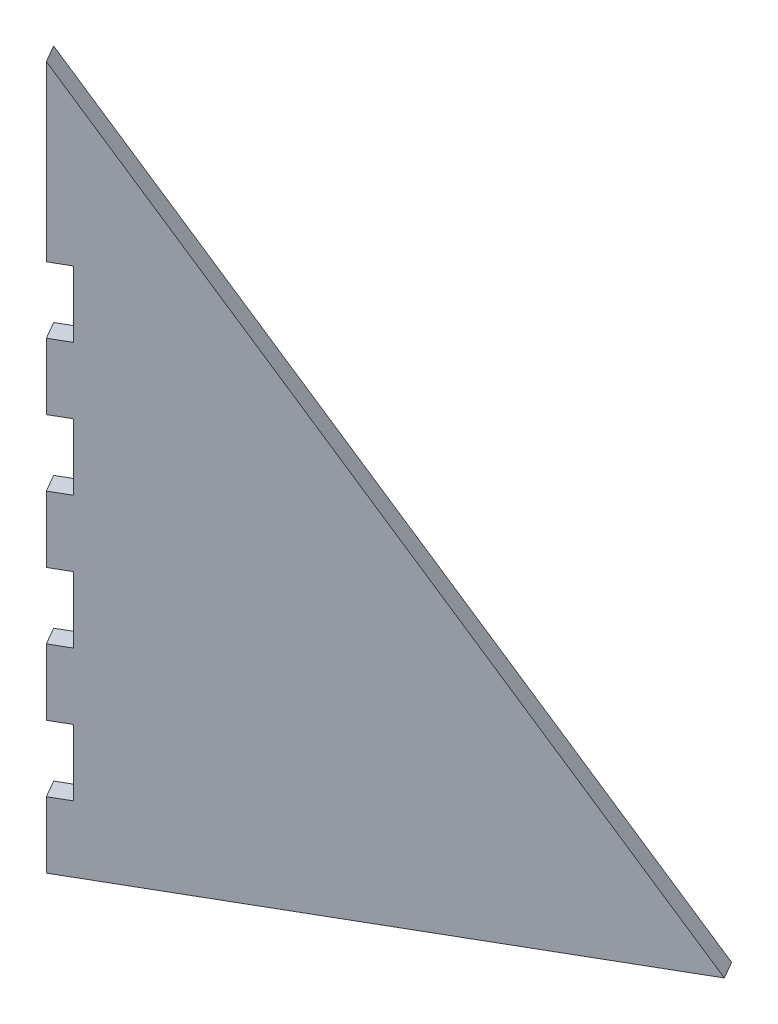
ISO-10303-21;
HEADER;
FILE_DESCRIPTION(('STEP AP214'),'2;1');
FILE_NAME('part.step','',(''),(''),'','','');
FILE_SCHEMA(('AUTOMOTIVE_DESIGN { 1 0 10303 214 1 1 1 1 }'));
ENDSEC;
DATA;
#1=APPLICATION_CONTEXT('core data for automotive mechanical design processes');
#2=APPLICATION_PROTOCOL_DEFINITION('international standard','automotive_design',2000,#1);
#3=PRODUCT_CONTEXT('',#1,'mechanical');
#4=PRODUCT('Part','Part','',(#3));
#5=PRODUCT_RELATED_PRODUCT_CATEGORY('part','',(#4));
#6=PRODUCT_DEFINITION_FORMATION('','',#4);
#7=PRODUCT_DEFINITION_CONTEXT('part definition',#1,'design');
#8=PRODUCT_DEFINITION('design','',#6,#7);
#9=PRODUCT_DEFINITION_SHAPE('','',#8);
#10=(LENGTH_UNIT() NAMED_UNIT(*) SI_UNIT(.MILLI.,.METRE.));
#11=(NAMED_UNIT(*) PLANE_ANGLE_UNIT() SI_UNIT($,.RADIAN.));
#12=(NAMED_UNIT(*) SI_UNIT($,.STERADIAN.) SOLID_ANGLE_UNIT());
#13=UNCERTAINTY_MEASURE_WITH_UNIT(LENGTH_MEASURE(1.E-05),#10,'distance_accuracy_value','');
#14=(GEOMETRIC_REPRESENTATION_CONTEXT(3) GLOBAL_UNCERTAINTY_ASSIGNED_CONTEXT((#13)) GLOBAL_UNIT_ASSIGNED_CONTEXT((#10,
#11,#12)) REPRESENTATION_CONTEXT('',''));
#15=CARTESIAN_POINT('',(0.,0.,0.));
#16=DIRECTION('',(0.,0.,1.));
#17=DIRECTION('',(1.,0.,0.));
#18=AXIS2_PLACEMENT_3D('',#15,#16,#17);
#19=CARTESIAN_POINT('',(207.708225560257,79.9999999999998,353.761199820341));
#20=DIRECTION('',(0.866025403784437,0.,-0.500000000000002));
#21=DIRECTION('',(-0.500000000000002,0.,-0.866025403784437));
#22=AXIS2_PLACEMENT_3D('',#19,#20,#21);
#23=PLANE('',#22);
#24=DIRECTION('',(0.,1.,0.));
#25=VECTOR('',#24,1.);
#26=CARTESIAN_POINT('',(209.208225560257,79.9999999999998,356.359276031694));
#27=LINE('',#26,#25);
#28=CARTESIAN_POINT('',(209.208225560257,79.9999999999998,356.359276031694));
#29=VERTEX_POINT('',#28);
#30=CARTESIAN_POINT('',(209.208225560257,106.192051124606,356.359276031694));
#31=VERTEX_POINT('',#30);
#32=EDGE_CURVE('E195',#29,#31,#27,.T.);
#33=ORIENTED_EDGE('',*,*,#32,.T.);
#34=DIRECTION('',(0.500000000000002,0.,0.866025403784437));
#35=VECTOR('',#34,1.);
#36=CARTESIAN_POINT('',(207.708225560257,106.192051124606,353.761199820341));
#37=LINE('',#36,#35);
#38=CARTESIAN_POINT('',(207.708225560257,106.192051124606,353.761199820341));
#39=VERTEX_POINT('',#38);
#40=EDGE_CURVE('E11',#39,#31,#37,.T.);
#41=ORIENTED_EDGE('',*,*,#40,.F.);
#42=DIRECTION('',(0.,1.,0.));
#43=VECTOR('',#42,1.);
#44=CARTESIAN_POINT('',(207.708225560257,79.9999999999998,353.761199820341));
#45=LINE('',#44,#43);
#46=CARTESIAN_POINT('',(207.708225560257,79.9999999999998,353.761199820341));
#47=VERTEX_POINT('',#46);
#48=EDGE_CURVE('E231',#47,#39,#45,.T.);
#49=ORIENTED_EDGE('',*,*,#48,.F.);
#50=DIRECTION('',(0.500000000000002,0.,0.866025403784437));
#51=VECTOR('',#50,1.);
#52=CARTESIAN_POINT('',(207.708225560257,79.9999999999998,353.761199820341));
#53=LINE('',#52,#51);
#54=EDGE_CURVE('E191',#47,#29,#53,.T.);
#55=ORIENTED_EDGE('',*,*,#54,.T.);
#56=EDGE_LOOP('',(#33,#41,#49,#55));
#57=FACE_BOUND('',#56,.T.);
#58=ADVANCED_FACE('F33',(#57),#23,.F.);
#59=CARTESIAN_POINT('',(207.708225560257,106.192051124606,353.761199820341));
#60=DIRECTION('',(-0.707386524128565,-0.576893179576377,0.408409800126743));
#61=DIRECTION('',(0.632004833598678,-0.774964444544333,0.));
#62=AXIS2_PLACEMENT_3D('',#59,#60,#61);
#63=PLANE('',#62);
#64=DIRECTION('',(0.49960414878312,-0.816819600253482,-0.28844658978819));
#65=VECTOR('',#64,1.);
#66=CARTESIAN_POINT('',(209.208225560257,106.192051124606,356.359276031694));
#67=LINE('',#66,#65);
#68=CARTESIAN_POINT('',(274.16013084409,-2.89305556641071E-13,318.859276031694));
#69=VERTEX_POINT('',#68);
#70=EDGE_CURVE('E198',#31,#69,#67,.T.);
#71=ORIENTED_EDGE('',*,*,#70,.T.);
#72=DIRECTION('',(0.500000000000002,0.,0.866025403784437));
#73=VECTOR('',#72,1.);
#74=CARTESIAN_POINT('',(272.66013084409,-2.89305556641071E-13,316.261199820341));
#75=LINE('',#74,#73);
#76=CARTESIAN_POINT('',(272.66013084409,-2.89305556641071E-13,316.261199820341));
#77=VERTEX_POINT('',#76);
#78=EDGE_CURVE('E41',#77,#69,#75,.T.);
#79=ORIENTED_EDGE('',*,*,#78,.F.);
#80=DIRECTION('',(0.49960414878312,-0.816819600253482,-0.28844658978819));
#81=VECTOR('',#80,1.);
#82=CARTESIAN_POINT('',(207.708225560257,106.192051124606,353.761199820341));
#83=LINE('',#82,#81);
#84=EDGE_CURVE('E125',#39,#77,#83,.T.);
#85=ORIENTED_EDGE('',*,*,#84,.F.);
#86=ORIENTED_EDGE('',*,*,#40,.T.);
#87=EDGE_LOOP('',(#71,#79,#85,#86));
#88=FACE_BOUND('',#87,.T.);
#89=ADVANCED_FACE('F344',(#88),#63,.F.);
#90=CARTESIAN_POINT('',(272.66013084409,-2.89305556641071E-13,316.261199820341));
#91=DIRECTION('',(0.,1.,0.));
#92=DIRECTION('',(-1.,0.,0.));
#93=AXIS2_PLACEMENT_3D('',#90,#91,#92);
#94=PLANE('',#93);
#95=DIRECTION('',(-0.866025403784437,0.,0.500000000000003));
#96=VECTOR('',#95,1.);
#97=CARTESIAN_POINT('',(274.16013084409,-2.89305556641071E-13,318.859276031694));
#98=LINE('',#97,#96);
#99=CARTESIAN_POINT('',(209.208225560257,0.,356.359276031695));
#100=VERTEX_POINT('',#99);
#101=EDGE_CURVE('E200',#69,#100,#98,.T.);
#102=ORIENTED_EDGE('',*,*,#101,.T.);
#103=DIRECTION('',(0.500000000000002,0.,0.866025403784437));
#104=VECTOR('',#103,1.);
#105=CARTESIAN_POINT('',(207.708225560257,0.,353.761199820341));
#106=LINE('',#105,#104);
#107=CARTESIAN_POINT('',(207.708225560257,0.,353.761199820341));
#108=VERTEX_POINT('',#107);
#109=EDGE_CURVE('E271',#108,#100,#106,.T.);
#110=ORIENTED_EDGE('',*,*,#109,.F.);
#111=DIRECTION('',(-0.866025403784437,0.,0.500000000000003));
#112=VECTOR('',#111,1.);
#113=CARTESIAN_POINT('',(272.66013084409,-2.89305556641071E-13,316.261199820341));
#114=LINE('',#113,#112);
#115=EDGE_CURVE('E279',#77,#108,#114,.T.);
#116=ORIENTED_EDGE('',*,*,#115,.F.);
#117=ORIENTED_EDGE('',*,*,#78,.T.);
#118=EDGE_LOOP('',(#102,#110,#116,#117));
#119=FACE_BOUND('',#118,.T.);
#120=ADVANCED_FACE('F277',(#119),#94,.F.);
#121=CARTESIAN_POINT('',(207.708225560257,0.,353.761199820341));
#122=DIRECTION('',(0.866025403784437,0.,-0.500000000000002));
#123=DIRECTION('',(-0.500000000000002,0.,-0.866025403784437));
#124=AXIS2_PLACEMENT_3D('',#121,#122,#123);
#125=PLANE('',#124);
#126=DIRECTION('',(0.,1.,0.));
#127=VECTOR('',#126,1.);
#128=CARTESIAN_POINT('',(209.208225560257,0.,356.359276031695));
#129=LINE('',#128,#127);
#130=CARTESIAN_POINT('',(209.208225560257,9.99999999999973,356.359276031695));
#131=VERTEX_POINT('',#130);
#132=EDGE_CURVE('E202',#100,#131,#129,.T.);
#133=ORIENTED_EDGE('',*,*,#132,.T.);
#134=DIRECTION('',(0.500000000000002,0.,0.866025403784437));
#135=VECTOR('',#134,1.);
#136=CARTESIAN_POINT('',(207.708225560257,9.99999999999973,353.761199820341));
#137=LINE('',#136,#135);
#138=CARTESIAN_POINT('',(207.708225560257,9.99999999999973,353.761199820341));
#139=VERTEX_POINT('',#138);
#140=EDGE_CURVE('E268',#139,#131,#137,.T.);
#141=ORIENTED_EDGE('',*,*,#140,.F.);
#142=DIRECTION('',(0.,1.,0.));
#143=VECTOR('',#142,1.);
#144=CARTESIAN_POINT('',(207.708225560257,0.,353.761199820341));
#145=LINE('',#144,#143);
#146=EDGE_CURVE('E297',#108,#139,#145,.T.);
#147=ORIENTED_EDGE('',*,*,#146,.F.);
#148=ORIENTED_EDGE('',*,*,#109,.T.);
#149=EDGE_LOOP('',(#133,#141,#147,#148));
#150=FACE_BOUND('',#149,.T.);
#151=ADVANCED_FACE('F288',(#150),#125,.F.);
#152=CARTESIAN_POINT('',(210.30630177161,9.99999999999971,352.261199820341));
#153=DIRECTION('',(0.,-1.,0.));
#154=DIRECTION('',(1.,0.,0.));
#155=AXIS2_PLACEMENT_3D('',#152,#153,#154);
#156=PLANE('',#155);
#157=DIRECTION('',(0.866025403784434,0.,-0.500000000000008));
#158=VECTOR('',#157,1.);
#159=CARTESIAN_POINT('',(211.80630177161,9.99999999999971,354.859276031694));
#160=LINE('',#159,#158);
#161=CARTESIAN_POINT('',(211.80630177161,9.99999999999971,354.859276031694));
#162=VERTEX_POINT('',#161);
#163=EDGE_CURVE('E204',#131,#162,#160,.T.);
#164=ORIENTED_EDGE('',*,*,#163,.T.);
#165=DIRECTION('',(0.500000000000002,0.,0.866025403784437));
#166=VECTOR('',#165,1.);
#167=CARTESIAN_POINT('',(210.30630177161,9.99999999999971,352.261199820341));
#168=LINE('',#167,#166);
#169=CARTESIAN_POINT('',(210.30630177161,9.99999999999971,352.261199820341));
#170=VERTEX_POINT('',#169);
#171=EDGE_CURVE('E265',#170,#162,#168,.T.);
#172=ORIENTED_EDGE('',*,*,#171,.F.);
#173=DIRECTION('',(0.866025403784434,0.,-0.500000000000008));
#174=VECTOR('',#173,1.);
#175=CARTESIAN_POINT('',(210.30630177161,9.99999999999971,352.261199820341));
#176=LINE('',#175,#174);
#177=EDGE_CURVE('E294',#139,#170,#176,.T.);
#178=ORIENTED_EDGE('',*,*,#177,.F.);
#179=ORIENTED_EDGE('',*,*,#140,.T.);
#180=EDGE_LOOP('',(#164,#172,#178,#179));
#181=FACE_BOUND('',#180,.T.);
#182=ADVANCED_FACE('F292',(#181),#156,.F.);
#183=CARTESIAN_POINT('',(210.30630177161,9.99999999999971,352.261199820341));
#184=DIRECTION('',(0.866025403784437,0.,-0.500000000000002));
#185=DIRECTION('',(-0.500000000000002,0.,-0.866025403784437));
#186=AXIS2_PLACEMENT_3D('',#183,#184,#185);
#187=PLANE('',#186);
#188=DIRECTION('',(0.,1.,0.));
#189=VECTOR('',#188,1.);
#190=CARTESIAN_POINT('',(211.80630177161,9.99999999999971,354.859276031694));
#191=LINE('',#190,#189);
#192=CARTESIAN_POINT('',(211.806301771611,19.9999999999997,354.859276031694));
#193=VERTEX_POINT('',#192);
#194=EDGE_CURVE('E206',#162,#193,#191,.T.);
#195=ORIENTED_EDGE('',*,*,#194,.T.);
#196=DIRECTION('',(0.500000000000002,0.,0.866025403784437));
#197=VECTOR('',#196,1.);
#198=CARTESIAN_POINT('',(210.306301771611,19.9999999999997,352.261199820341));
#199=LINE('',#198,#197);
#200=CARTESIAN_POINT('',(210.306301771611,19.9999999999997,352.261199820341));
#201=VERTEX_POINT('',#200);
#202=EDGE_CURVE('E262',#201,#193,#199,.T.);
#203=ORIENTED_EDGE('',*,*,#202,.F.);
#204=DIRECTION('',(0.,1.,0.));
#205=VECTOR('',#204,1.);
#206=CARTESIAN_POINT('',(210.30630177161,9.99999999999971,352.261199820341));
#207=LINE('',#206,#205);
#208=EDGE_CURVE('E296',#170,#201,#207,.T.);
#209=ORIENTED_EDGE('',*,*,#208,.F.);
#210=ORIENTED_EDGE('',*,*,#171,.T.);
#211=EDGE_LOOP('',(#195,#203,#209,#210));
#212=FACE_BOUND('',#211,.T.);
#213=ADVANCED_FACE('F357',(#212),#187,.F.);
#214=CARTESIAN_POINT('',(210.306301771611,19.9999999999997,352.261199820341));
#215=DIRECTION('',(0.,1.,0.));
#216=DIRECTION('',(-1.,0.,0.));
#217=AXIS2_PLACEMENT_3D('',#214,#215,#216);
#218=PLANE('',#217);
#219=DIRECTION('',(-0.866025403784433,0.,0.50000000000001));
#220=VECTOR('',#219,1.);
#221=CARTESIAN_POINT('',(211.806301771611,19.9999999999997,354.859276031694));
#222=LINE('',#221,#220);
#223=CARTESIAN_POINT('',(209.208225560257,19.9999999999997,356.359276031695));
#224=VERTEX_POINT('',#223);
#225=EDGE_CURVE('E208',#193,#224,#222,.T.);
#226=ORIENTED_EDGE('',*,*,#225,.T.);
#227=DIRECTION('',(0.500000000000002,0.,0.866025403784437));
#228=VECTOR('',#227,1.);
#229=CARTESIAN_POINT('',(207.708225560257,19.9999999999997,353.761199820341));
#230=LINE('',#229,#228);
#231=CARTESIAN_POINT('',(207.708225560257,19.9999999999997,353.761199820341));
#232=VERTEX_POINT('',#231);
#233=EDGE_CURVE('E259',#232,#224,#230,.T.);
#234=ORIENTED_EDGE('',*,*,#233,.F.);
#235=DIRECTION('',(-0.866025403784433,0.,0.50000000000001));
#236=VECTOR('',#235,1.);
#237=CARTESIAN_POINT('',(210.306301771611,19.9999999999997,352.261199820341));
#238=LINE('',#237,#236);
#239=EDGE_CURVE('E299',#201,#232,#238,.T.);
#240=ORIENTED_EDGE('',*,*,#239,.F.);
#241=ORIENTED_EDGE('',*,*,#202,.T.);
#242=EDGE_LOOP('',(#226,#234,#240,#241));
#243=FACE_BOUND('',#242,.T.);
#244=ADVANCED_FACE('F360',(#243),#218,.F.);
#245=CARTESIAN_POINT('',(207.708225560257,19.9999999999997,353.761199820341));
#246=DIRECTION('',(0.866025403784437,0.,-0.500000000000002));
#247=DIRECTION('',(-0.500000000000002,0.,-0.866025403784437));
#248=AXIS2_PLACEMENT_3D('',#245,#246,#247);
#249=PLANE('',#248);
#250=DIRECTION('',(0.,1.,0.));
#251=VECTOR('',#250,1.);
#252=CARTESIAN_POINT('',(209.208225560257,19.9999999999997,356.359276031695));
#253=LINE('',#252,#251);
#254=CARTESIAN_POINT('',(209.208225560257,29.9999999999998,356.359276031695));
#255=VERTEX_POINT('',#254);
#256=EDGE_CURVE('E210',#224,#255,#253,.T.);
#257=ORIENTED_EDGE('',*,*,#256,.T.);
#258=DIRECTION('',(0.500000000000002,0.,0.866025403784437));
#259=VECTOR('',#258,1.);
#260=CARTESIAN_POINT('',(207.708225560257,29.9999999999998,353.761199820341));
#261=LINE('',#260,#259);
#262=CARTESIAN_POINT('',(207.708225560257,29.9999999999998,353.761199820341));
#263=VERTEX_POINT('',#262);
#264=EDGE_CURVE('E256',#263,#255,#261,.T.);
#265=ORIENTED_EDGE('',*,*,#264,.F.);
#266=DIRECTION('',(0.,1.,0.));
#267=VECTOR('',#266,1.);
#268=CARTESIAN_POINT('',(207.708225560257,19.9999999999997,353.761199820341));
#269=LINE('',#268,#267);
#270=EDGE_CURVE('E305',#232,#263,#269,.T.);
#271=ORIENTED_EDGE('',*,*,#270,.F.);
#272=ORIENTED_EDGE('',*,*,#233,.T.);
#273=EDGE_LOOP('',(#257,#265,#271,#272));
#274=FACE_BOUND('',#273,.T.);
#275=ADVANCED_FACE('F364',(#274),#249,.F.);
#276=CARTESIAN_POINT('',(210.30630177161,29.9999999999999,352.261199820341));
#277=DIRECTION('',(0.,-1.,0.));
#278=DIRECTION('',(1.,0.,0.));
#279=AXIS2_PLACEMENT_3D('',#276,#277,#278);
#280=PLANE('',#279);
#281=DIRECTION('',(0.866025403784429,0.,-0.500000000000016));
#282=VECTOR('',#281,1.);
#283=CARTESIAN_POINT('',(211.80630177161,29.9999999999999,354.859276031694));
#284=LINE('',#283,#282);
#285=CARTESIAN_POINT('',(211.80630177161,29.9999999999999,354.859276031694));
#286=VERTEX_POINT('',#285);
#287=EDGE_CURVE('E212',#255,#286,#284,.T.);
#288=ORIENTED_EDGE('',*,*,#287,.T.);
#289=DIRECTION('',(0.500000000000002,0.,0.866025403784437));
#290=VECTOR('',#289,1.);
#291=CARTESIAN_POINT('',(210.30630177161,29.9999999999999,352.261199820341));
#292=LINE('',#291,#290);
#293=CARTESIAN_POINT('',(210.30630177161,29.9999999999999,352.261199820341));
#294=VERTEX_POINT('',#293);
#295=EDGE_CURVE('E253',#294,#286,#292,.T.);
#296=ORIENTED_EDGE('',*,*,#295,.F.);
#297=DIRECTION('',(0.866025403784429,0.,-0.500000000000016));
#298=VECTOR('',#297,1.);
#299=CARTESIAN_POINT('',(210.30630177161,29.9999999999999,352.261199820341));
#300=LINE('',#299,#298);
#301=EDGE_CURVE('E307',#263,#294,#300,.T.);
#302=ORIENTED_EDGE('',*,*,#301,.F.);
#303=ORIENTED_EDGE('',*,*,#264,.T.);
#304=EDGE_LOOP('',(#288,#296,#302,#303));
#305=FACE_BOUND('',#304,.T.);
#306=ADVANCED_FACE('F368',(#305),#280,.F.);
#307=CARTESIAN_POINT('',(210.30630177161,29.9999999999999,352.261199820341));
#308=DIRECTION('',(0.866025403784437,0.,-0.500000000000002));
#309=DIRECTION('',(-0.500000000000002,0.,-0.866025403784437));
#310=AXIS2_PLACEMENT_3D('',#307,#308,#309);
#311=PLANE('',#310);
#312=DIRECTION('',(0.,1.,0.));
#313=VECTOR('',#312,1.);
#314=CARTESIAN_POINT('',(211.80630177161,29.9999999999999,354.859276031694));
#315=LINE('',#314,#313);
#316=CARTESIAN_POINT('',(211.80630177161,39.9999999999999,354.859276031694));
#317=VERTEX_POINT('',#316);
#318=EDGE_CURVE('E214',#286,#317,#315,.T.);
#319=ORIENTED_EDGE('',*,*,#318,.T.);
#320=DIRECTION('',(0.500000000000002,0.,0.866025403784437));
#321=VECTOR('',#320,1.);
#322=CARTESIAN_POINT('',(210.30630177161,39.9999999999999,352.261199820341));
#323=LINE('',#322,#321);
#324=CARTESIAN_POINT('',(210.30630177161,39.9999999999999,352.261199820341));
#325=VERTEX_POINT('',#324);
#326=EDGE_CURVE('E250',#325,#317,#323,.T.);
#327=ORIENTED_EDGE('',*,*,#326,.F.);
#328=DIRECTION('',(0.,1.,0.));
#329=VECTOR('',#328,1.);
#330=CARTESIAN_POINT('',(210.30630177161,29.9999999999999,352.261199820341));
#331=LINE('',#330,#329);
#332=EDGE_CURVE('E309',#294,#325,#331,.T.);
#333=ORIENTED_EDGE('',*,*,#332,.F.);
#334=ORIENTED_EDGE('',*,*,#295,.T.);
#335=EDGE_LOOP('',(#319,#327,#333,#334));
#336=FACE_BOUND('',#335,.T.);
#337=ADVANCED_FACE('F372',(#336),#311,.F.);
#338=CARTESIAN_POINT('',(210.30630177161,39.9999999999999,352.261199820341));
#339=DIRECTION('',(0.,1.,0.));
#340=DIRECTION('',(-1.,0.,0.));
#341=AXIS2_PLACEMENT_3D('',#338,#339,#340);
#342=PLANE('',#341);
#343=DIRECTION('',(-0.866025403784429,0.,0.500000000000016));
#344=VECTOR('',#343,1.);
#345=CARTESIAN_POINT('',(211.80630177161,39.9999999999999,354.859276031694));
#346=LINE('',#345,#344);
#347=CARTESIAN_POINT('',(209.208225560257,39.9999999999998,356.359276031695));
#348=VERTEX_POINT('',#347);
#349=EDGE_CURVE('E216',#317,#348,#346,.T.);
#350=ORIENTED_EDGE('',*,*,#349,.T.);
#351=DIRECTION('',(0.500000000000002,0.,0.866025403784437));
#352=VECTOR('',#351,1.);
#353=CARTESIAN_POINT('',(207.708225560257,39.9999999999998,353.761199820341));
#354=LINE('',#353,#352);
#355=CARTESIAN_POINT('',(207.708225560257,39.9999999999998,353.761199820341));
#356=VERTEX_POINT('',#355);
#357=EDGE_CURVE('E247',#356,#348,#354,.T.);
#358=ORIENTED_EDGE('',*,*,#357,.F.);
#359=DIRECTION('',(-0.866025403784429,0.,0.500000000000016));
#360=VECTOR('',#359,1.);
#361=CARTESIAN_POINT('',(210.30630177161,39.9999999999999,352.261199820341));
#362=LINE('',#361,#360);
#363=EDGE_CURVE('E311',#325,#356,#362,.T.);
#364=ORIENTED_EDGE('',*,*,#363,.F.);
#365=ORIENTED_EDGE('',*,*,#326,.T.);
#366=EDGE_LOOP('',(#350,#358,#364,#365));
#367=FACE_BOUND('',#366,.T.);
#368=ADVANCED_FACE('F376',(#367),#342,.F.);
#369=CARTESIAN_POINT('',(207.708225560257,39.9999999999998,353.761199820341));
#370=DIRECTION('',(0.866025403784437,0.,-0.500000000000002));
#371=DIRECTION('',(-0.500000000000002,0.,-0.866025403784437));
#372=AXIS2_PLACEMENT_3D('',#369,#370,#371);
#373=PLANE('',#372);
#374=DIRECTION('',(0.,1.,0.));
#375=VECTOR('',#374,1.);
#376=CARTESIAN_POINT('',(209.208225560257,39.9999999999998,356.359276031695));
#377=LINE('',#376,#375);
#378=CARTESIAN_POINT('',(209.208225560257,49.9999999999998,356.359276031695));
#379=VERTEX_POINT('',#378);
#380=EDGE_CURVE('E218',#348,#379,#377,.T.);
#381=ORIENTED_EDGE('',*,*,#380,.T.);
#382=DIRECTION('',(0.500000000000002,0.,0.866025403784437));
#383=VECTOR('',#382,1.);
#384=CARTESIAN_POINT('',(207.708225560257,49.9999999999998,353.761199820341));
#385=LINE('',#384,#383);
#386=CARTESIAN_POINT('',(207.708225560257,49.9999999999998,353.761199820341));
#387=VERTEX_POINT('',#386);
#388=EDGE_CURVE('E244',#387,#379,#385,.T.);
#389=ORIENTED_EDGE('',*,*,#388,.F.);
#390=DIRECTION('',(0.,1.,0.));
#391=VECTOR('',#390,1.);
#392=CARTESIAN_POINT('',(207.708225560257,39.9999999999998,353.761199820341));
#393=LINE('',#392,#391);
#394=EDGE_CURVE('E313',#356,#387,#393,.T.);
#395=ORIENTED_EDGE('',*,*,#394,.F.);
#396=ORIENTED_EDGE('',*,*,#357,.T.);
#397=EDGE_LOOP('',(#381,#389,#395,#396));
#398=FACE_BOUND('',#397,.T.);
#399=ADVANCED_FACE('F380',(#398),#373,.F.);
#400=CARTESIAN_POINT('',(210.30630177161,49.9999999999999,352.261199820341));
#401=DIRECTION('',(0.,-1.,0.));
#402=DIRECTION('',(1.,0.,0.));
#403=AXIS2_PLACEMENT_3D('',#400,#401,#402);
#404=PLANE('',#403);
#405=DIRECTION('',(0.866025403784429,0.,-0.500000000000016));
#406=VECTOR('',#405,1.);
#407=CARTESIAN_POINT('',(211.80630177161,49.9999999999999,354.859276031694));
#408=LINE('',#407,#406);
#409=CARTESIAN_POINT('',(211.80630177161,49.9999999999999,354.859276031694));
#410=VERTEX_POINT('',#409);
#411=EDGE_CURVE('E220',#379,#410,#408,.T.);
#412=ORIENTED_EDGE('',*,*,#411,.T.);
#413=DIRECTION('',(0.500000000000002,0.,0.866025403784437));
#414=VECTOR('',#413,1.);
#415=CARTESIAN_POINT('',(210.30630177161,49.9999999999999,352.261199820341));
#416=LINE('',#415,#414);
#417=CARTESIAN_POINT('',(210.30630177161,49.9999999999999,352.261199820341));
#418=VERTEX_POINT('',#417);
#419=EDGE_CURVE('E241',#418,#410,#416,.T.);
#420=ORIENTED_EDGE('',*,*,#419,.F.);
#421=DIRECTION('',(0.866025403784429,0.,-0.500000000000016));
#422=VECTOR('',#421,1.);
#423=CARTESIAN_POINT('',(210.30630177161,49.9999999999999,352.261199820341));
#424=LINE('',#423,#422);
#425=EDGE_CURVE('E315',#387,#418,#424,.T.);
#426=ORIENTED_EDGE('',*,*,#425,.F.);
#427=ORIENTED_EDGE('',*,*,#388,.T.);
#428=EDGE_LOOP('',(#412,#420,#426,#427));
#429=FACE_BOUND('',#428,.T.);
#430=ADVANCED_FACE('F384',(#429),#404,.F.);
#431=CARTESIAN_POINT('',(210.30630177161,49.9999999999999,352.261199820341));
#432=DIRECTION('',(0.866025403784437,0.,-0.500000000000002));
#433=DIRECTION('',(-0.500000000000002,0.,-0.866025403784437));
#434=AXIS2_PLACEMENT_3D('',#431,#432,#433);
#435=PLANE('',#434);
#436=DIRECTION('',(0.,1.,0.));
#437=VECTOR('',#436,1.);
#438=CARTESIAN_POINT('',(211.80630177161,49.9999999999999,354.859276031694));
#439=LINE('',#438,#437);
#440=CARTESIAN_POINT('',(211.80630177161,59.9999999999999,354.859276031694));
#441=VERTEX_POINT('',#440);
#442=EDGE_CURVE('E222',#410,#441,#439,.T.);
#443=ORIENTED_EDGE('',*,*,#442,.T.);
#444=DIRECTION('',(0.500000000000002,0.,0.866025403784437));
#445=VECTOR('',#444,1.);
#446=CARTESIAN_POINT('',(210.30630177161,59.9999999999999,352.261199820341));
#447=LINE('',#446,#445);
#448=CARTESIAN_POINT('',(210.30630177161,59.9999999999999,352.261199820341));
#449=VERTEX_POINT('',#448);
#450=EDGE_CURVE('E238',#449,#441,#447,.T.);
#451=ORIENTED_EDGE('',*,*,#450,.F.);
#452=DIRECTION('',(0.,1.,0.));
#453=VECTOR('',#452,1.);
#454=CARTESIAN_POINT('',(210.30630177161,49.9999999999999,352.261199820341));
#455=LINE('',#454,#453);
#456=EDGE_CURVE('E317',#418,#449,#455,.T.);
#457=ORIENTED_EDGE('',*,*,#456,.F.);
#458=ORIENTED_EDGE('',*,*,#419,.T.);
#459=EDGE_LOOP('',(#443,#451,#457,#458));
#460=FACE_BOUND('',#459,.T.);
#461=ADVANCED_FACE('F388',(#460),#435,.F.);
#462=CARTESIAN_POINT('',(210.30630177161,59.9999999999999,352.261199820341));
#463=DIRECTION('',(0.,1.,0.));
#464=DIRECTION('',(-1.,0.,0.));
#465=AXIS2_PLACEMENT_3D('',#462,#463,#464);
#466=PLANE('',#465);
#467=DIRECTION('',(-0.866025403784429,0.,0.500000000000016));
#468=VECTOR('',#467,1.);
#469=CARTESIAN_POINT('',(211.80630177161,59.9999999999999,354.859276031694));
#470=LINE('',#469,#468);
#471=CARTESIAN_POINT('',(209.208225560257,59.9999999999998,356.359276031695));
#472=VERTEX_POINT('',#471);
#473=EDGE_CURVE('E224',#441,#472,#470,.T.);
#474=ORIENTED_EDGE('',*,*,#473,.T.);
#475=DIRECTION('',(0.500000000000002,0.,0.866025403784437));
#476=VECTOR('',#475,1.);
#477=CARTESIAN_POINT('',(207.708225560257,59.9999999999998,353.761199820341));
#478=LINE('',#477,#476);
#479=CARTESIAN_POINT('',(207.708225560257,59.9999999999998,353.761199820341));
#480=VERTEX_POINT('',#479);
#481=EDGE_CURVE('E235',#480,#472,#478,.T.);
#482=ORIENTED_EDGE('',*,*,#481,.F.);
#483=DIRECTION('',(-0.866025403784429,0.,0.500000000000016));
#484=VECTOR('',#483,1.);
#485=CARTESIAN_POINT('',(210.30630177161,59.9999999999999,352.261199820341));
#486=LINE('',#485,#484);
#487=EDGE_CURVE('E319',#449,#480,#486,.T.);
#488=ORIENTED_EDGE('',*,*,#487,.F.);
#489=ORIENTED_EDGE('',*,*,#450,.T.);
#490=EDGE_LOOP('',(#474,#482,#488,#489));
#491=FACE_BOUND('',#490,.T.);
#492=ADVANCED_FACE('F325',(#491),#466,.F.);
#493=CARTESIAN_POINT('',(207.708225560257,59.9999999999998,353.761199820341));
#494=DIRECTION('',(0.866025403784437,0.,-0.500000000000002));
#495=DIRECTION('',(-0.500000000000002,0.,-0.866025403784437));
#496=AXIS2_PLACEMENT_3D('',#493,#494,#495);
#497=PLANE('',#496);
#498=DIRECTION('',(0.,1.,0.));
#499=VECTOR('',#498,1.);
#500=CARTESIAN_POINT('',(209.208225560257,59.9999999999998,356.359276031695));
#501=LINE('',#500,#499);
#502=CARTESIAN_POINT('',(209.208225560257,69.9999999999998,356.359276031695));
#503=VERTEX_POINT('',#502);
#504=EDGE_CURVE('E226',#472,#503,#501,.T.);
#505=ORIENTED_EDGE('',*,*,#504,.T.);
#506=DIRECTION('',(0.500000000000002,0.,0.866025403784437));
#507=VECTOR('',#506,1.);
#508=CARTESIAN_POINT('',(207.708225560257,69.9999999999998,353.761199820341));
#509=LINE('',#508,#507);
#510=CARTESIAN_POINT('',(207.708225560257,69.9999999999998,353.761199820341));
#511=VERTEX_POINT('',#510);
#512=EDGE_CURVE('E186',#511,#503,#509,.T.);
#513=ORIENTED_EDGE('',*,*,#512,.F.);
#514=DIRECTION('',(0.,1.,0.));
#515=VECTOR('',#514,1.);
#516=CARTESIAN_POINT('',(207.708225560257,59.9999999999998,353.761199820341));
#517=LINE('',#516,#515);
#518=EDGE_CURVE('E177',#480,#511,#517,.T.);
#519=ORIENTED_EDGE('',*,*,#518,.F.);
#520=ORIENTED_EDGE('',*,*,#481,.T.);
#521=EDGE_LOOP('',(#505,#513,#519,#520));
#522=FACE_BOUND('',#521,.T.);
#523=ADVANCED_FACE('F329',(#522),#497,.F.);
#524=CARTESIAN_POINT('',(210.30630177161,69.9999999999999,352.261199820341));
#525=DIRECTION('',(0.,-1.,0.));
#526=DIRECTION('',(1.,0.,0.));
#527=AXIS2_PLACEMENT_3D('',#524,#525,#526);
#528=PLANE('',#527);
#529=DIRECTION('',(0.866025403784429,0.,-0.500000000000016));
#530=VECTOR('',#529,1.);
#531=CARTESIAN_POINT('',(211.80630177161,69.9999999999999,354.859276031694));
#532=LINE('',#531,#530);
#533=CARTESIAN_POINT('',(211.80630177161,69.9999999999999,354.859276031694));
#534=VERTEX_POINT('',#533);
#535=EDGE_CURVE('E185',#503,#534,#532,.T.);
#536=ORIENTED_EDGE('',*,*,#535,.T.);
#537=DIRECTION('',(0.500000000000002,0.,0.866025403784437));
#538=VECTOR('',#537,1.);
#539=CARTESIAN_POINT('',(210.30630177161,69.9999999999999,352.261199820341));
#540=LINE('',#539,#538);
#541=CARTESIAN_POINT('',(210.30630177161,69.9999999999999,352.261199820341));
#542=VERTEX_POINT('',#541);
#543=EDGE_CURVE('E182',#542,#534,#540,.T.);
#544=ORIENTED_EDGE('',*,*,#543,.F.);
#545=DIRECTION('',(0.866025403784429,0.,-0.500000000000016));
#546=VECTOR('',#545,1.);
#547=CARTESIAN_POINT('',(210.30630177161,69.9999999999999,352.261199820341));
#548=LINE('',#547,#546);
#549=EDGE_CURVE('E171',#511,#542,#548,.T.);
#550=ORIENTED_EDGE('',*,*,#549,.F.);
#551=ORIENTED_EDGE('',*,*,#512,.T.);
#552=EDGE_LOOP('',(#536,#544,#550,#551));
#553=FACE_BOUND('',#552,.T.);
#554=ADVANCED_FACE('F183',(#553),#528,.F.);
#555=CARTESIAN_POINT('',(210.30630177161,69.9999999999999,352.261199820341));
#556=DIRECTION('',(0.866025403784437,0.,-0.500000000000002));
#557=DIRECTION('',(-0.500000000000002,0.,-0.866025403784437));
#558=AXIS2_PLACEMENT_3D('',#555,#556,#557);
#559=PLANE('',#558);
#560=DIRECTION('',(0.,1.,0.));
#561=VECTOR('',#560,1.);
#562=CARTESIAN_POINT('',(211.80630177161,69.9999999999999,354.859276031694));
#563=LINE('',#562,#561);
#564=CARTESIAN_POINT('',(211.80630177161,79.9999999999999,354.859276031694));
#565=VERTEX_POINT('',#564);
#566=EDGE_CURVE('E111',#534,#565,#563,.T.);
#567=ORIENTED_EDGE('',*,*,#566,.T.);
#568=DIRECTION('',(0.500000000000002,0.,0.866025403784437));
#569=VECTOR('',#568,1.);
#570=CARTESIAN_POINT('',(210.30630177161,79.9999999999999,352.261199820341));
#571=LINE('',#570,#569);
#572=CARTESIAN_POINT('',(210.30630177161,79.9999999999999,352.261199820341));
#573=VERTEX_POINT('',#572);
#574=EDGE_CURVE('E187',#573,#565,#571,.T.);
#575=ORIENTED_EDGE('',*,*,#574,.F.);
#576=DIRECTION('',(0.,1.,0.));
#577=VECTOR('',#576,1.);
#578=CARTESIAN_POINT('',(210.30630177161,69.9999999999999,352.261199820341));
#579=LINE('',#578,#577);
#580=EDGE_CURVE('E175',#542,#573,#579,.T.);
#581=ORIENTED_EDGE('',*,*,#580,.F.);
#582=ORIENTED_EDGE('',*,*,#543,.T.);
#583=EDGE_LOOP('',(#567,#575,#581,#582));
#584=FACE_BOUND('',#583,.T.);
#585=ADVANCED_FACE('F189',(#584),#559,.F.);
#586=CARTESIAN_POINT('',(210.30630177161,79.9999999999999,352.261199820341));
#587=DIRECTION('',(0.,1.,0.));
#588=DIRECTION('',(-1.,0.,0.));
#589=AXIS2_PLACEMENT_3D('',#586,#587,#588);
#590=PLANE('',#589);
#591=DIRECTION('',(-0.866025403784437,0.,0.500000000000003));
#592=VECTOR('',#591,1.);
#593=CARTESIAN_POINT('',(211.80630177161,79.9999999999999,354.859276031694));
#594=LINE('',#593,#592);
#595=EDGE_CURVE('E117',#565,#29,#594,.T.);
#596=ORIENTED_EDGE('',*,*,#595,.T.);
#597=ORIENTED_EDGE('',*,*,#54,.F.);
#598=DIRECTION('',(-0.866025403784437,0.,0.500000000000003));
#599=VECTOR('',#598,1.);
#600=CARTESIAN_POINT('',(210.30630177161,79.9999999999999,352.261199820341));
#601=LINE('',#600,#599);
#602=EDGE_CURVE('E49',#573,#47,#601,.T.);
#603=ORIENTED_EDGE('',*,*,#602,.F.);
#604=ORIENTED_EDGE('',*,*,#574,.T.);
#605=EDGE_LOOP('',(#596,#597,#603,#604));
#606=FACE_BOUND('',#605,.T.);
#607=ADVANCED_FACE('F333',(#606),#590,.F.);
#608=CARTESIAN_POINT('',(205.110149348905,0.,355.261199820341));
#609=DIRECTION('',(0.500000000000003,0.,0.866025403784437));
#610=DIRECTION('',(0.866025403784437,0.,-0.500000000000003));
#611=AXIS2_PLACEMENT_3D('',#608,#609,#610);
#612=PLANE('',#611);
#613=ORIENTED_EDGE('',*,*,#48,.T.);
#614=ORIENTED_EDGE('',*,*,#84,.T.);
#615=ORIENTED_EDGE('',*,*,#115,.T.);
#616=ORIENTED_EDGE('',*,*,#146,.T.);
#617=ORIENTED_EDGE('',*,*,#177,.T.);
#618=ORIENTED_EDGE('',*,*,#208,.T.);
#619=ORIENTED_EDGE('',*,*,#239,.T.);
#620=ORIENTED_EDGE('',*,*,#270,.T.);
#621=ORIENTED_EDGE('',*,*,#301,.T.);
#622=ORIENTED_EDGE('',*,*,#332,.T.);
#623=ORIENTED_EDGE('',*,*,#363,.T.);
#624=ORIENTED_EDGE('',*,*,#394,.T.);
#625=ORIENTED_EDGE('',*,*,#425,.T.);
#626=ORIENTED_EDGE('',*,*,#456,.T.);
#627=ORIENTED_EDGE('',*,*,#487,.T.);
#628=ORIENTED_EDGE('',*,*,#518,.T.);
#629=ORIENTED_EDGE('',*,*,#549,.T.);
#630=ORIENTED_EDGE('',*,*,#580,.T.);
#631=ORIENTED_EDGE('',*,*,#602,.T.);
#632=EDGE_LOOP('',(#613,#614,#615,#616,#617,#618,#619,#620,#621,#622,#623,#624,#625,#626,#627,
#628,#629,#630,#631));
#633=FACE_BOUND('',#632,.T.);
#634=ADVANCED_FACE('F173',(#633),#612,.F.);
#635=CARTESIAN_POINT('',(206.610149348905,0.,357.859276031694));
#636=DIRECTION('',(0.500000000000003,0.,0.866025403784437));
#637=DIRECTION('',(0.866025403784437,0.,-0.500000000000003));
#638=AXIS2_PLACEMENT_3D('',#635,#636,#637);
#639=PLANE('',#638);
#640=ORIENTED_EDGE('',*,*,#32,.F.);
#641=ORIENTED_EDGE('',*,*,#595,.F.);
#642=ORIENTED_EDGE('',*,*,#566,.F.);
#643=ORIENTED_EDGE('',*,*,#535,.F.);
#644=ORIENTED_EDGE('',*,*,#504,.F.);
#645=ORIENTED_EDGE('',*,*,#473,.F.);
#646=ORIENTED_EDGE('',*,*,#442,.F.);
#647=ORIENTED_EDGE('',*,*,#411,.F.);
#648=ORIENTED_EDGE('',*,*,#380,.F.);
#649=ORIENTED_EDGE('',*,*,#349,.F.);
#650=ORIENTED_EDGE('',*,*,#318,.F.);
#651=ORIENTED_EDGE('',*,*,#287,.F.);
#652=ORIENTED_EDGE('',*,*,#256,.F.);
#653=ORIENTED_EDGE('',*,*,#225,.F.);
#654=ORIENTED_EDGE('',*,*,#194,.F.);
#655=ORIENTED_EDGE('',*,*,#163,.F.);
#656=ORIENTED_EDGE('',*,*,#132,.F.);
#657=ORIENTED_EDGE('',*,*,#101,.F.);
#658=ORIENTED_EDGE('',*,*,#70,.F.);
#659=EDGE_LOOP('',(#640,#641,#642,#643,#644,#645,#646,#647,#648,#649,#650,#651,#652,#653,#654,
#655,#656,#657,#658));
#660=FACE_BOUND('',#659,.T.);
#661=ADVANCED_FACE('F283',(#660),#639,.T.);
#662=CLOSED_SHELL('',(#58,#89,#120,#151,#182,#213,#244,#275,#306,#337,#368,#399,#430,#461,#492,
#523,#554,#585,#607,#634,#661));
#663=MANIFOLD_SOLID_BREP('B2',#662);
#664=ADVANCED_BREP_SHAPE_REPRESENTATION('',(#18,#663),#14);
#665=SHAPE_DEFINITION_REPRESENTATION(#9,#664);
ENDSEC;
END-ISO-10303-21;
